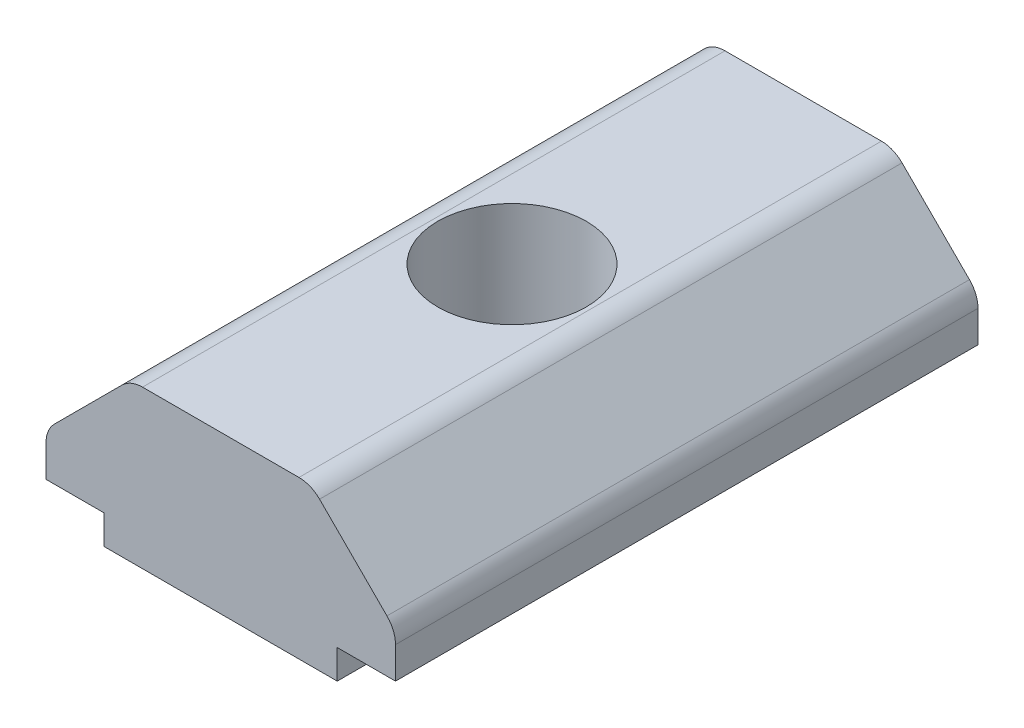
ISO-10303-21;
HEADER;
FILE_DESCRIPTION(('STEP AP214'),'2;1');
FILE_NAME('part.step','',(''),(''),'','','');
FILE_SCHEMA(('AUTOMOTIVE_DESIGN { 1 0 10303 214 1 1 1 1 }'));
ENDSEC;
DATA;
#1=APPLICATION_CONTEXT('core data for automotive mechanical design processes');
#2=APPLICATION_PROTOCOL_DEFINITION('international standard','automotive_design',2000,#1);
#3=PRODUCT_CONTEXT('',#1,'mechanical');
#4=PRODUCT('Part','Part','',(#3));
#5=PRODUCT_RELATED_PRODUCT_CATEGORY('part','',(#4));
#6=PRODUCT_DEFINITION_FORMATION('','',#4);
#7=PRODUCT_DEFINITION_CONTEXT('part definition',#1,'design');
#8=PRODUCT_DEFINITION('design','',#6,#7);
#9=PRODUCT_DEFINITION_SHAPE('','',#8);
#10=(LENGTH_UNIT() NAMED_UNIT(*) SI_UNIT(.MILLI.,.METRE.));
#11=(NAMED_UNIT(*) PLANE_ANGLE_UNIT() SI_UNIT($,.RADIAN.));
#12=(NAMED_UNIT(*) SI_UNIT($,.STERADIAN.) SOLID_ANGLE_UNIT());
#13=UNCERTAINTY_MEASURE_WITH_UNIT(LENGTH_MEASURE(1.E-05),#10,'distance_accuracy_value','');
#14=(GEOMETRIC_REPRESENTATION_CONTEXT(3) GLOBAL_UNCERTAINTY_ASSIGNED_CONTEXT((#13)) GLOBAL_UNIT_ASSIGNED_CONTEXT((#10,
#11,#12)) REPRESENTATION_CONTEXT('',''));
#15=CARTESIAN_POINT('',(0.,0.,0.));
#16=DIRECTION('',(0.,0.,1.));
#17=DIRECTION('',(1.,0.,0.));
#18=AXIS2_PLACEMENT_3D('',#15,#16,#17);
#19=CARTESIAN_POINT('',(0.,1.,20.));
#20=DIRECTION('',(1.,0.,0.));
#21=DIRECTION('',(0.,0.,-1.));
#22=AXIS2_PLACEMENT_3D('',#19,#20,#21);
#23=PLANE('',#22);
#24=DIRECTION('',(0.,-1.,0.));
#25=VECTOR('',#24,1.);
#26=CARTESIAN_POINT('',(0.,1.,0.));
#27=LINE('',#26,#25);
#28=CARTESIAN_POINT('',(0.,1.,0.));
#29=VERTEX_POINT('',#28);
#30=CARTESIAN_POINT('',(0.,0.,0.));
#31=VERTEX_POINT('',#30);
#32=EDGE_CURVE('E156',#29,#31,#27,.T.);
#33=ORIENTED_EDGE('',*,*,#32,.T.);
#34=DIRECTION('',(0.,0.,-1.));
#35=VECTOR('',#34,1.);
#36=CARTESIAN_POINT('',(0.,0.,20.));
#37=LINE('',#36,#35);
#38=CARTESIAN_POINT('',(0.,0.,20.));
#39=VERTEX_POINT('',#38);
#40=EDGE_CURVE('E137',#39,#31,#37,.T.);
#41=ORIENTED_EDGE('',*,*,#40,.F.);
#42=DIRECTION('',(0.,-1.,0.));
#43=VECTOR('',#42,1.);
#44=CARTESIAN_POINT('',(0.,1.,20.));
#45=LINE('',#44,#43);
#46=CARTESIAN_POINT('',(0.,1.,20.));
#47=VERTEX_POINT('',#46);
#48=EDGE_CURVE('E143',#47,#39,#45,.T.);
#49=ORIENTED_EDGE('',*,*,#48,.F.);
#50=DIRECTION('',(0.,0.,-1.));
#51=VECTOR('',#50,1.);
#52=CARTESIAN_POINT('',(0.,1.,20.));
#53=LINE('',#52,#51);
#54=EDGE_CURVE('E216',#47,#29,#53,.T.);
#55=ORIENTED_EDGE('',*,*,#54,.T.);
#56=EDGE_LOOP('',(#33,#41,#49,#55));
#57=FACE_BOUND('',#56,.T.);
#58=ADVANCED_FACE('F32',(#57),#23,.F.);
#59=CARTESIAN_POINT('',(0.,0.,20.));
#60=DIRECTION('',(0.,1.,0.));
#61=DIRECTION('',(0.,0.,1.));
#62=AXIS2_PLACEMENT_3D('',#59,#60,#61);
#63=PLANE('',#62);
#64=CARTESIAN_POINT('',(4.,0.,10.));
#65=DIRECTION('',(0.,1.,0.));
#66=DIRECTION('',(0.,0.,1.));
#67=AXIS2_PLACEMENT_3D('',#64,#65,#66);
#68=CIRCLE('',#67,2.55);
#69=CARTESIAN_POINT('',(4.,0.,12.55));
#70=VERTEX_POINT('',#69);
#71=EDGE_CURVE('E243',#70,#70,#68,.T.);
#72=ORIENTED_EDGE('',*,*,#71,.T.);
#73=EDGE_LOOP('',(#72));
#74=FACE_BOUND('',#73,.T.);
#75=DIRECTION('',(1.,0.,0.));
#76=VECTOR('',#75,1.);
#77=CARTESIAN_POINT('',(0.,0.,0.));
#78=LINE('',#77,#76);
#79=CARTESIAN_POINT('',(8.,0.,0.));
#80=VERTEX_POINT('',#79);
#81=EDGE_CURVE('E238',#31,#80,#78,.T.);
#82=ORIENTED_EDGE('',*,*,#81,.T.);
#83=DIRECTION('',(0.,0.,-1.));
#84=VECTOR('',#83,1.);
#85=CARTESIAN_POINT('',(8.,0.,20.));
#86=LINE('',#85,#84);
#87=CARTESIAN_POINT('',(8.,0.,20.));
#88=VERTEX_POINT('',#87);
#89=EDGE_CURVE('E140',#88,#80,#86,.T.);
#90=ORIENTED_EDGE('',*,*,#89,.F.);
#91=DIRECTION('',(1.,0.,0.));
#92=VECTOR('',#91,1.);
#93=CARTESIAN_POINT('',(0.,0.,20.));
#94=LINE('',#93,#92);
#95=EDGE_CURVE('E133',#39,#88,#94,.T.);
#96=ORIENTED_EDGE('',*,*,#95,.F.);
#97=ORIENTED_EDGE('',*,*,#40,.T.);
#98=EDGE_LOOP('',(#82,#90,#96,#97));
#99=FACE_BOUND('',#98,.T.);
#100=ADVANCED_FACE('F135',(#74,#99),#63,.F.);
#101=CARTESIAN_POINT('',(8.,0.,20.));
#102=DIRECTION('',(-1.,0.,0.));
#103=DIRECTION('',(0.,0.,1.));
#104=AXIS2_PLACEMENT_3D('',#101,#102,#103);
#105=PLANE('',#104);
#106=DIRECTION('',(0.,1.,0.));
#107=VECTOR('',#106,1.);
#108=CARTESIAN_POINT('',(8.,0.,0.));
#109=LINE('',#108,#107);
#110=CARTESIAN_POINT('',(8.,1.,0.));
#111=VERTEX_POINT('',#110);
#112=EDGE_CURVE('E235',#80,#111,#109,.T.);
#113=ORIENTED_EDGE('',*,*,#112,.T.);
#114=DIRECTION('',(0.,0.,-1.));
#115=VECTOR('',#114,1.);
#116=CARTESIAN_POINT('',(8.,1.,20.));
#117=LINE('',#116,#115);
#118=CARTESIAN_POINT('',(8.,1.,20.));
#119=VERTEX_POINT('',#118);
#120=EDGE_CURVE('E162',#119,#111,#117,.T.);
#121=ORIENTED_EDGE('',*,*,#120,.F.);
#122=DIRECTION('',(0.,1.,0.));
#123=VECTOR('',#122,1.);
#124=CARTESIAN_POINT('',(8.,0.,20.));
#125=LINE('',#124,#123);
#126=EDGE_CURVE('E142',#88,#119,#125,.T.);
#127=ORIENTED_EDGE('',*,*,#126,.F.);
#128=ORIENTED_EDGE('',*,*,#89,.T.);
#129=EDGE_LOOP('',(#113,#121,#127,#128));
#130=FACE_BOUND('',#129,.T.);
#131=ADVANCED_FACE('F289',(#130),#105,.F.);
#132=CARTESIAN_POINT('',(8.,1.,20.));
#133=DIRECTION('',(0.,1.,0.));
#134=DIRECTION('',(0.,0.,1.));
#135=AXIS2_PLACEMENT_3D('',#132,#133,#134);
#136=PLANE('',#135);
#137=DIRECTION('',(1.,0.,0.));
#138=VECTOR('',#137,1.);
#139=CARTESIAN_POINT('',(8.,1.,0.));
#140=LINE('',#139,#138);
#141=CARTESIAN_POINT('',(10.,1.,0.));
#142=VERTEX_POINT('',#141);
#143=EDGE_CURVE('E230',#111,#142,#140,.T.);
#144=ORIENTED_EDGE('',*,*,#143,.T.);
#145=DIRECTION('',(0.,0.,-1.));
#146=VECTOR('',#145,1.);
#147=CARTESIAN_POINT('',(10.,1.,20.));
#148=LINE('',#147,#146);
#149=CARTESIAN_POINT('',(10.,1.,20.));
#150=VERTEX_POINT('',#149);
#151=EDGE_CURVE('E221',#150,#142,#148,.T.);
#152=ORIENTED_EDGE('',*,*,#151,.F.);
#153=DIRECTION('',(1.,0.,0.));
#154=VECTOR('',#153,1.);
#155=CARTESIAN_POINT('',(8.,1.,20.));
#156=LINE('',#155,#154);
#157=EDGE_CURVE('E231',#119,#150,#156,.T.);
#158=ORIENTED_EDGE('',*,*,#157,.F.);
#159=ORIENTED_EDGE('',*,*,#120,.T.);
#160=EDGE_LOOP('',(#144,#152,#158,#159));
#161=FACE_BOUND('',#160,.T.);
#162=ADVANCED_FACE('F228',(#161),#136,.F.);
#163=CARTESIAN_POINT('',(10.,1.,20.));
#164=DIRECTION('',(-1.,0.,0.));
#165=DIRECTION('',(0.,0.,1.));
#166=AXIS2_PLACEMENT_3D('',#163,#164,#165);
#167=PLANE('',#166);
#168=DIRECTION('',(0.,1.,0.));
#169=VECTOR('',#168,1.);
#170=CARTESIAN_POINT('',(10.,1.,0.));
#171=LINE('',#170,#169);
#172=CARTESIAN_POINT('',(10.,2.0857864376269,0.));
#173=VERTEX_POINT('',#172);
#174=EDGE_CURVE('E210',#142,#173,#171,.T.);
#175=ORIENTED_EDGE('',*,*,#174,.T.);
#176=DIRECTION('',(0.,0.,-1.));
#177=VECTOR('',#176,1.);
#178=CARTESIAN_POINT('',(10.,2.0857864376269,20.));
#179=LINE('',#178,#177);
#180=CARTESIAN_POINT('',(10.,2.0857864376269,20.));
#181=VERTEX_POINT('',#180);
#182=EDGE_CURVE('E190',#173,#181,#179,.F.);
#183=ORIENTED_EDGE('',*,*,#182,.T.);
#184=DIRECTION('',(0.,1.,0.));
#185=VECTOR('',#184,1.);
#186=CARTESIAN_POINT('',(10.,1.,20.));
#187=LINE('',#186,#185);
#188=EDGE_CURVE('E252',#150,#181,#187,.T.);
#189=ORIENTED_EDGE('',*,*,#188,.F.);
#190=ORIENTED_EDGE('',*,*,#151,.T.);
#191=EDGE_LOOP('',(#175,#183,#189,#190));
#192=FACE_BOUND('',#191,.T.);
#193=ADVANCED_FACE('F281',(#192),#167,.F.);
#194=CARTESIAN_POINT('',(10.,2.5,20.));
#195=DIRECTION('',(-0.707106781186548,-0.707106781186548,0.));
#196=DIRECTION('',(0.707106781186548,-0.707106781186548,0.));
#197=AXIS2_PLACEMENT_3D('',#194,#195,#196);
#198=PLANE('',#197);
#199=DIRECTION('',(-0.707106781186548,0.707106781186548,0.));
#200=VECTOR('',#199,1.);
#201=CARTESIAN_POINT('',(10.,2.5,20.));
#202=LINE('',#201,#200);
#203=CARTESIAN_POINT('',(9.70710678118655,2.79289321881345,20.));
#204=VERTEX_POINT('',#203);
#205=CARTESIAN_POINT('',(7.39289321881345,5.10710678118655,20.));
#206=VERTEX_POINT('',#205);
#207=EDGE_CURVE('E250',#204,#206,#202,.T.);
#208=ORIENTED_EDGE('',*,*,#207,.F.);
#209=DIRECTION('',(0.,0.,-1.));
#210=VECTOR('',#209,1.);
#211=CARTESIAN_POINT('',(9.70710678118655,2.79289321881345,20.));
#212=LINE('',#211,#210);
#213=CARTESIAN_POINT('',(9.70710678118655,2.79289321881345,0.));
#214=VERTEX_POINT('',#213);
#215=EDGE_CURVE('E187',#204,#214,#212,.T.);
#216=ORIENTED_EDGE('',*,*,#215,.T.);
#217=DIRECTION('',(-0.707106781186548,0.707106781186548,0.));
#218=VECTOR('',#217,1.);
#219=CARTESIAN_POINT('',(10.,2.5,0.));
#220=LINE('',#219,#218);
#221=CARTESIAN_POINT('',(7.39289321881345,5.10710678118655,0.));
#222=VERTEX_POINT('',#221);
#223=EDGE_CURVE('E205',#214,#222,#220,.T.);
#224=ORIENTED_EDGE('',*,*,#223,.T.);
#225=DIRECTION('',(0.,0.,-1.));
#226=VECTOR('',#225,1.);
#227=CARTESIAN_POINT('',(7.39289321881345,5.10710678118655,20.));
#228=LINE('',#227,#226);
#229=EDGE_CURVE('E185',#222,#206,#228,.F.);
#230=ORIENTED_EDGE('',*,*,#229,.T.);
#231=EDGE_LOOP('',(#208,#216,#224,#230));
#232=FACE_BOUND('',#231,.T.);
#233=ADVANCED_FACE('F272',(#232),#198,.F.);
#234=CARTESIAN_POINT('',(7.1,5.4,20.));
#235=DIRECTION('',(0.,-1.,0.));
#236=DIRECTION('',(0.,0.,-1.));
#237=AXIS2_PLACEMENT_3D('',#234,#235,#236);
#238=PLANE('',#237);
#239=CARTESIAN_POINT('',(4.,5.4,10.));
#240=DIRECTION('',(0.,1.,0.));
#241=DIRECTION('',(0.,0.,1.));
#242=AXIS2_PLACEMENT_3D('',#239,#240,#241);
#243=CIRCLE('',#242,2.55);
#244=CARTESIAN_POINT('',(4.,5.4,12.55));
#245=VERTEX_POINT('',#244);
#246=EDGE_CURVE('E257',#245,#245,#243,.T.);
#247=ORIENTED_EDGE('',*,*,#246,.F.);
#248=EDGE_LOOP('',(#247));
#249=FACE_BOUND('',#248,.T.);
#250=DIRECTION('',(-1.,0.,0.));
#251=VECTOR('',#250,1.);
#252=CARTESIAN_POINT('',(7.1,5.4,0.));
#253=LINE('',#252,#251);
#254=CARTESIAN_POINT('',(6.68578643762691,5.4,0.));
#255=VERTEX_POINT('',#254);
#256=CARTESIAN_POINT('',(1.3142135623731,5.4,0.));
#257=VERTEX_POINT('',#256);
#258=EDGE_CURVE('E195',#255,#257,#253,.T.);
#259=ORIENTED_EDGE('',*,*,#258,.T.);
#260=DIRECTION('',(0.,0.,-1.));
#261=VECTOR('',#260,1.);
#262=CARTESIAN_POINT('',(1.3142135623731,5.4,20.));
#263=LINE('',#262,#261);
#264=CARTESIAN_POINT('',(1.3142135623731,5.4,20.));
#265=VERTEX_POINT('',#264);
#266=EDGE_CURVE('E11',#257,#265,#263,.F.);
#267=ORIENTED_EDGE('',*,*,#266,.T.);
#268=DIRECTION('',(-1.,0.,0.));
#269=VECTOR('',#268,1.);
#270=CARTESIAN_POINT('',(7.1,5.4,20.));
#271=LINE('',#270,#269);
#272=CARTESIAN_POINT('',(6.68578643762691,5.4,20.));
#273=VERTEX_POINT('',#272);
#274=EDGE_CURVE('E196',#273,#265,#271,.T.);
#275=ORIENTED_EDGE('',*,*,#274,.F.);
#276=DIRECTION('',(0.,0.,-1.));
#277=VECTOR('',#276,1.);
#278=CARTESIAN_POINT('',(6.68578643762691,5.4,20.));
#279=LINE('',#278,#277);
#280=EDGE_CURVE('E40',#273,#255,#279,.T.);
#281=ORIENTED_EDGE('',*,*,#280,.T.);
#282=EDGE_LOOP('',(#259,#267,#275,#281));
#283=FACE_BOUND('',#282,.T.);
#284=ADVANCED_FACE('F194',(#249,#283),#238,.F.);
#285=CARTESIAN_POINT('',(0.9,5.4,20.));
#286=DIRECTION('',(0.707106781186548,-0.707106781186548,0.));
#287=DIRECTION('',(0.707106781186548,0.707106781186548,0.));
#288=AXIS2_PLACEMENT_3D('',#285,#286,#287);
#289=PLANE('',#288);
#290=DIRECTION('',(-0.707106781186548,-0.707106781186548,0.));
#291=VECTOR('',#290,1.);
#292=CARTESIAN_POINT('',(0.9,5.4,0.));
#293=LINE('',#292,#291);
#294=CARTESIAN_POINT('',(0.607106781186548,5.10710678118655,0.));
#295=VERTEX_POINT('',#294);
#296=CARTESIAN_POINT('',(-1.70710678118655,2.79289321881345,0.));
#297=VERTEX_POINT('',#296);
#298=EDGE_CURVE('E204',#295,#297,#293,.T.);
#299=ORIENTED_EDGE('',*,*,#298,.T.);
#300=DIRECTION('',(0.,0.,-1.));
#301=VECTOR('',#300,1.);
#302=CARTESIAN_POINT('',(-1.70710678118655,2.79289321881345,20.));
#303=LINE('',#302,#301);
#304=CARTESIAN_POINT('',(-1.70710678118655,2.79289321881345,20.));
#305=VERTEX_POINT('',#304);
#306=EDGE_CURVE('E176',#297,#305,#303,.F.);
#307=ORIENTED_EDGE('',*,*,#306,.T.);
#308=DIRECTION('',(-0.707106781186548,-0.707106781186548,0.));
#309=VECTOR('',#308,1.);
#310=CARTESIAN_POINT('',(0.9,5.4,20.));
#311=LINE('',#310,#309);
#312=CARTESIAN_POINT('',(0.607106781186548,5.10710678118655,20.));
#313=VERTEX_POINT('',#312);
#314=EDGE_CURVE('E247',#313,#305,#311,.T.);
#315=ORIENTED_EDGE('',*,*,#314,.F.);
#316=DIRECTION('',(0.,0.,-1.));
#317=VECTOR('',#316,1.);
#318=CARTESIAN_POINT('',(0.607106781186548,5.10710678118655,20.));
#319=LINE('',#318,#317);
#320=EDGE_CURVE('E173',#313,#295,#319,.T.);
#321=ORIENTED_EDGE('',*,*,#320,.T.);
#322=EDGE_LOOP('',(#299,#307,#315,#321));
#323=FACE_BOUND('',#322,.T.);
#324=ADVANCED_FACE('F271',(#323),#289,.F.);
#325=CARTESIAN_POINT('',(-2.,2.5,20.));
#326=DIRECTION('',(1.,0.,0.));
#327=DIRECTION('',(0.,1.,0.));
#328=AXIS2_PLACEMENT_3D('',#325,#326,#327);
#329=PLANE('',#328);
#330=DIRECTION('',(0.,-1.,0.));
#331=VECTOR('',#330,1.);
#332=CARTESIAN_POINT('',(-2.,2.5,20.));
#333=LINE('',#332,#331);
#334=CARTESIAN_POINT('',(-2.,2.08578643762691,20.));
#335=VERTEX_POINT('',#334);
#336=CARTESIAN_POINT('',(-2.,1.,20.));
#337=VERTEX_POINT('',#336);
#338=EDGE_CURVE('E245',#335,#337,#333,.T.);
#339=ORIENTED_EDGE('',*,*,#338,.F.);
#340=DIRECTION('',(0.,0.,-1.));
#341=VECTOR('',#340,1.);
#342=CARTESIAN_POINT('',(-2.,2.08578643762691,20.));
#343=LINE('',#342,#341);
#344=CARTESIAN_POINT('',(-2.,2.08578643762691,0.));
#345=VERTEX_POINT('',#344);
#346=EDGE_CURVE('E157',#335,#345,#343,.T.);
#347=ORIENTED_EDGE('',*,*,#346,.T.);
#348=DIRECTION('',(0.,-1.,0.));
#349=VECTOR('',#348,1.);
#350=CARTESIAN_POINT('',(-2.,2.5,0.));
#351=LINE('',#350,#349);
#352=CARTESIAN_POINT('',(-2.,1.,0.));
#353=VERTEX_POINT('',#352);
#354=EDGE_CURVE('E208',#345,#353,#351,.T.);
#355=ORIENTED_EDGE('',*,*,#354,.T.);
#356=DIRECTION('',(0.,0.,-1.));
#357=VECTOR('',#356,1.);
#358=CARTESIAN_POINT('',(-2.,1.,20.));
#359=LINE('',#358,#357);
#360=EDGE_CURVE('E218',#337,#353,#359,.T.);
#361=ORIENTED_EDGE('',*,*,#360,.F.);
#362=EDGE_LOOP('',(#339,#347,#355,#361));
#363=FACE_BOUND('',#362,.T.);
#364=ADVANCED_FACE('F278',(#363),#329,.F.);
#365=CARTESIAN_POINT('',(-2.,1.,20.));
#366=DIRECTION('',(0.,1.,0.));
#367=DIRECTION('',(0.,0.,1.));
#368=AXIS2_PLACEMENT_3D('',#365,#366,#367);
#369=PLANE('',#368);
#370=DIRECTION('',(1.,0.,0.));
#371=VECTOR('',#370,1.);
#372=CARTESIAN_POINT('',(-2.,1.,0.));
#373=LINE('',#372,#371);
#374=EDGE_CURVE('E153',#353,#29,#373,.T.);
#375=ORIENTED_EDGE('',*,*,#374,.T.);
#376=ORIENTED_EDGE('',*,*,#54,.F.);
#377=DIRECTION('',(1.,0.,0.));
#378=VECTOR('',#377,1.);
#379=CARTESIAN_POINT('',(-2.,1.,20.));
#380=LINE('',#379,#378);
#381=EDGE_CURVE('E149',#337,#47,#380,.T.);
#382=ORIENTED_EDGE('',*,*,#381,.F.);
#383=ORIENTED_EDGE('',*,*,#360,.T.);
#384=EDGE_LOOP('',(#375,#376,#382,#383));
#385=FACE_BOUND('',#384,.T.);
#386=ADVANCED_FACE('F317',(#385),#369,.F.);
#387=CARTESIAN_POINT('',(0.,0.,20.));
#388=DIRECTION('',(0.,0.,1.));
#389=DIRECTION('',(1.,0.,0.));
#390=AXIS2_PLACEMENT_3D('',#387,#388,#389);
#391=PLANE('',#390);
#392=ORIENTED_EDGE('',*,*,#314,.T.);
#393=CARTESIAN_POINT('',(-1.,2.08578643762691,20.));
#394=DIRECTION('',(0.,0.,1.));
#395=DIRECTION('',(1.,0.,0.));
#396=AXIS2_PLACEMENT_3D('',#393,#394,#395);
#397=CIRCLE('',#396,1.);
#398=EDGE_CURVE('E183',#305,#335,#397,.T.);
#399=ORIENTED_EDGE('',*,*,#398,.T.);
#400=ORIENTED_EDGE('',*,*,#338,.T.);
#401=ORIENTED_EDGE('',*,*,#381,.T.);
#402=ORIENTED_EDGE('',*,*,#48,.T.);
#403=ORIENTED_EDGE('',*,*,#95,.T.);
#404=ORIENTED_EDGE('',*,*,#126,.T.);
#405=ORIENTED_EDGE('',*,*,#157,.T.);
#406=ORIENTED_EDGE('',*,*,#188,.T.);
#407=CARTESIAN_POINT('',(9.,2.0857864376269,20.));
#408=DIRECTION('',(0.,0.,1.));
#409=DIRECTION('',(1.,0.,0.));
#410=AXIS2_PLACEMENT_3D('',#407,#408,#409);
#411=CIRCLE('',#410,1.);
#412=EDGE_CURVE('E181',#181,#204,#411,.T.);
#413=ORIENTED_EDGE('',*,*,#412,.T.);
#414=ORIENTED_EDGE('',*,*,#207,.T.);
#415=CARTESIAN_POINT('',(6.68578643762691,4.4,20.));
#416=DIRECTION('',(0.,0.,1.));
#417=DIRECTION('',(1.,0.,0.));
#418=AXIS2_PLACEMENT_3D('',#415,#416,#417);
#419=CIRCLE('',#418,1.);
#420=EDGE_CURVE('E52',#206,#273,#419,.T.);
#421=ORIENTED_EDGE('',*,*,#420,.T.);
#422=ORIENTED_EDGE('',*,*,#274,.T.);
#423=CARTESIAN_POINT('',(1.3142135623731,4.4,20.));
#424=DIRECTION('',(0.,0.,1.));
#425=DIRECTION('',(1.,0.,0.));
#426=AXIS2_PLACEMENT_3D('',#423,#424,#425);
#427=CIRCLE('',#426,1.);
#428=EDGE_CURVE('E179',#265,#313,#427,.T.);
#429=ORIENTED_EDGE('',*,*,#428,.T.);
#430=EDGE_LOOP('',(#392,#399,#400,#401,#402,#403,#404,#405,#406,#413,#414,#421,#422,#429));
#431=FACE_BOUND('',#430,.T.);
#432=ADVANCED_FACE('F147',(#431),#391,.T.);
#433=CARTESIAN_POINT('',(0.,0.,0.));
#434=DIRECTION('',(0.,0.,1.));
#435=DIRECTION('',(1.,0.,0.));
#436=AXIS2_PLACEMENT_3D('',#433,#434,#435);
#437=PLANE('',#436);
#438=ORIENTED_EDGE('',*,*,#354,.F.);
#439=CARTESIAN_POINT('',(-1.,2.08578643762691,0.));
#440=DIRECTION('',(0.,0.,1.));
#441=DIRECTION('',(1.,0.,0.));
#442=AXIS2_PLACEMENT_3D('',#439,#440,#441);
#443=CIRCLE('',#442,1.);
#444=EDGE_CURVE('E171',#345,#297,#443,.F.);
#445=ORIENTED_EDGE('',*,*,#444,.T.);
#446=ORIENTED_EDGE('',*,*,#298,.F.);
#447=CARTESIAN_POINT('',(1.3142135623731,4.4,0.));
#448=DIRECTION('',(0.,0.,1.));
#449=DIRECTION('',(1.,0.,0.));
#450=AXIS2_PLACEMENT_3D('',#447,#448,#449);
#451=CIRCLE('',#450,1.);
#452=EDGE_CURVE('E167',#295,#257,#451,.F.);
#453=ORIENTED_EDGE('',*,*,#452,.T.);
#454=ORIENTED_EDGE('',*,*,#258,.F.);
#455=CARTESIAN_POINT('',(6.68578643762691,4.4,0.));
#456=DIRECTION('',(0.,0.,1.));
#457=DIRECTION('',(1.,0.,0.));
#458=AXIS2_PLACEMENT_3D('',#455,#456,#457);
#459=CIRCLE('',#458,1.);
#460=EDGE_CURVE('E160',#255,#222,#459,.F.);
#461=ORIENTED_EDGE('',*,*,#460,.T.);
#462=ORIENTED_EDGE('',*,*,#223,.F.);
#463=CARTESIAN_POINT('',(9.,2.0857864376269,0.));
#464=DIRECTION('',(0.,0.,1.));
#465=DIRECTION('',(1.,0.,0.));
#466=AXIS2_PLACEMENT_3D('',#463,#464,#465);
#467=CIRCLE('',#466,1.);
#468=EDGE_CURVE('E169',#214,#173,#467,.F.);
#469=ORIENTED_EDGE('',*,*,#468,.T.);
#470=ORIENTED_EDGE('',*,*,#174,.F.);
#471=ORIENTED_EDGE('',*,*,#143,.F.);
#472=ORIENTED_EDGE('',*,*,#112,.F.);
#473=ORIENTED_EDGE('',*,*,#81,.F.);
#474=ORIENTED_EDGE('',*,*,#32,.F.);
#475=ORIENTED_EDGE('',*,*,#374,.F.);
#476=EDGE_LOOP('',(#438,#445,#446,#453,#454,#461,#462,#469,#470,#471,#472,#473,#474,#475));
#477=FACE_BOUND('',#476,.T.);
#478=ADVANCED_FACE('F200',(#477),#437,.F.);
#479=CARTESIAN_POINT('',(-1.,2.08578643762691,20.));
#480=DIRECTION('',(0.,0.,-1.));
#481=DIRECTION('',(-1.,0.,0.));
#482=AXIS2_PLACEMENT_3D('',#479,#480,#481);
#483=CYLINDRICAL_SURFACE('',#482,1.);
#484=ORIENTED_EDGE('',*,*,#398,.F.);
#485=ORIENTED_EDGE('',*,*,#306,.F.);
#486=ORIENTED_EDGE('',*,*,#444,.F.);
#487=ORIENTED_EDGE('',*,*,#346,.F.);
#488=EDGE_LOOP('',(#484,#485,#486,#487));
#489=FACE_BOUND('',#488,.T.);
#490=ADVANCED_FACE('F293',(#489),#483,.T.);
#491=CARTESIAN_POINT('',(9.,2.0857864376269,20.));
#492=DIRECTION('',(0.,0.,-1.));
#493=DIRECTION('',(-1.,0.,0.));
#494=AXIS2_PLACEMENT_3D('',#491,#492,#493);
#495=CYLINDRICAL_SURFACE('',#494,1.);
#496=ORIENTED_EDGE('',*,*,#412,.F.);
#497=ORIENTED_EDGE('',*,*,#182,.F.);
#498=ORIENTED_EDGE('',*,*,#468,.F.);
#499=ORIENTED_EDGE('',*,*,#215,.F.);
#500=EDGE_LOOP('',(#496,#497,#498,#499));
#501=FACE_BOUND('',#500,.T.);
#502=ADVANCED_FACE('F296',(#501),#495,.T.);
#503=CARTESIAN_POINT('',(1.3142135623731,4.4,20.));
#504=DIRECTION('',(0.,0.,-1.));
#505=DIRECTION('',(-1.,0.,0.));
#506=AXIS2_PLACEMENT_3D('',#503,#504,#505);
#507=CYLINDRICAL_SURFACE('',#506,1.);
#508=ORIENTED_EDGE('',*,*,#428,.F.);
#509=ORIENTED_EDGE('',*,*,#266,.F.);
#510=ORIENTED_EDGE('',*,*,#452,.F.);
#511=ORIENTED_EDGE('',*,*,#320,.F.);
#512=EDGE_LOOP('',(#508,#509,#510,#511));
#513=FACE_BOUND('',#512,.T.);
#514=ADVANCED_FACE('F299',(#513),#507,.T.);
#515=CARTESIAN_POINT('',(6.68578643762691,4.4,20.));
#516=DIRECTION('',(0.,0.,-1.));
#517=DIRECTION('',(-1.,0.,0.));
#518=AXIS2_PLACEMENT_3D('',#515,#516,#517);
#519=CYLINDRICAL_SURFACE('',#518,1.);
#520=ORIENTED_EDGE('',*,*,#420,.F.);
#521=ORIENTED_EDGE('',*,*,#229,.F.);
#522=ORIENTED_EDGE('',*,*,#460,.F.);
#523=ORIENTED_EDGE('',*,*,#280,.F.);
#524=EDGE_LOOP('',(#520,#521,#522,#523));
#525=FACE_BOUND('',#524,.T.);
#526=ADVANCED_FACE('F34',(#525),#519,.T.);
#527=CARTESIAN_POINT('',(4.,0.,10.));
#528=DIRECTION('',(0.,1.,0.));
#529=DIRECTION('',(0.,0.,1.));
#530=AXIS2_PLACEMENT_3D('',#527,#528,#529);
#531=CYLINDRICAL_SURFACE('',#530,2.55);
#532=CARTESIAN_POINT('',(4.,0.,12.55));
#533=CARTESIAN_POINT('',(4.,0.05625,12.55));
#534=CARTESIAN_POINT('',(4.,0.1125,12.55));
#535=CARTESIAN_POINT('',(4.,0.225,12.55));
#536=CARTESIAN_POINT('',(4.,0.28125,12.55));
#537=CARTESIAN_POINT('',(4.,0.39375,12.55));
#538=CARTESIAN_POINT('',(4.,0.45,12.55));
#539=CARTESIAN_POINT('',(4.,0.5625,12.55));
#540=CARTESIAN_POINT('',(4.,0.61875,12.55));
#541=CARTESIAN_POINT('',(4.,0.73125,12.55));
#542=CARTESIAN_POINT('',(4.,0.7875,12.55));
#543=CARTESIAN_POINT('',(4.,0.9,12.55));
#544=CARTESIAN_POINT('',(4.,0.95625,12.55));
#545=CARTESIAN_POINT('',(4.,1.06875,12.55));
#546=CARTESIAN_POINT('',(4.,1.125,12.55));
#547=CARTESIAN_POINT('',(4.,1.2375,12.55));
#548=CARTESIAN_POINT('',(4.,1.29375,12.55));
#549=CARTESIAN_POINT('',(4.,1.40625,12.55));
#550=CARTESIAN_POINT('',(4.,1.4625,12.55));
#551=CARTESIAN_POINT('',(4.,1.575,12.55));
#552=CARTESIAN_POINT('',(4.,1.63125,12.55));
#553=CARTESIAN_POINT('',(4.,1.74375,12.55));
#554=CARTESIAN_POINT('',(4.,1.8,12.55));
#555=CARTESIAN_POINT('',(4.,1.9125,12.55));
#556=CARTESIAN_POINT('',(4.,1.96875,12.55));
#557=CARTESIAN_POINT('',(4.,2.08125,12.55));
#558=CARTESIAN_POINT('',(4.,2.1375,12.55));
#559=CARTESIAN_POINT('',(4.,2.25,12.55));
#560=CARTESIAN_POINT('',(4.,2.30625,12.55));
#561=CARTESIAN_POINT('',(4.,2.41875,12.55));
#562=CARTESIAN_POINT('',(4.,2.475,12.55));
#563=CARTESIAN_POINT('',(4.,2.5875,12.55));
#564=CARTESIAN_POINT('',(4.,2.64375,12.55));
#565=CARTESIAN_POINT('',(4.,2.75625,12.55));
#566=CARTESIAN_POINT('',(4.,2.8125,12.55));
#567=CARTESIAN_POINT('',(4.,2.925,12.55));
#568=CARTESIAN_POINT('',(4.,2.98125,12.55));
#569=CARTESIAN_POINT('',(4.,3.09375,12.55));
#570=CARTESIAN_POINT('',(4.,3.15,12.55));
#571=CARTESIAN_POINT('',(4.,3.2625,12.55));
#572=CARTESIAN_POINT('',(4.,3.31875,12.55));
#573=CARTESIAN_POINT('',(4.,3.43125,12.55));
#574=CARTESIAN_POINT('',(4.,3.4875,12.55));
#575=CARTESIAN_POINT('',(4.,3.6,12.55));
#576=CARTESIAN_POINT('',(4.,3.65625,12.55));
#577=CARTESIAN_POINT('',(4.,3.76875,12.55));
#578=CARTESIAN_POINT('',(4.,3.825,12.55));
#579=CARTESIAN_POINT('',(4.,3.9375,12.55));
#580=CARTESIAN_POINT('',(4.,3.99375,12.55));
#581=CARTESIAN_POINT('',(4.,4.10625,12.55));
#582=CARTESIAN_POINT('',(4.,4.1625,12.55));
#583=CARTESIAN_POINT('',(4.,4.275,12.55));
#584=CARTESIAN_POINT('',(4.,4.33125,12.55));
#585=CARTESIAN_POINT('',(4.,4.44375,12.55));
#586=CARTESIAN_POINT('',(4.,4.5,12.55));
#587=CARTESIAN_POINT('',(4.,4.6125,12.55));
#588=CARTESIAN_POINT('',(4.,4.66875,12.55));
#589=CARTESIAN_POINT('',(4.,4.78125,12.55));
#590=CARTESIAN_POINT('',(4.,4.8375,12.55));
#591=CARTESIAN_POINT('',(4.,4.95,12.55));
#592=CARTESIAN_POINT('',(4.,5.00625,12.55));
#593=CARTESIAN_POINT('',(4.,5.11875,12.55));
#594=CARTESIAN_POINT('',(4.,5.175,12.55));
#595=CARTESIAN_POINT('',(4.,5.2875,12.55));
#596=CARTESIAN_POINT('',(4.,5.34375,12.55));
#597=CARTESIAN_POINT('',(4.,5.4,12.55));
#598=B_SPLINE_CURVE_WITH_KNOTS('',3,(#532,#533,#534,#535,#536,#537,#538,#539,#540,#541,#542,
#543,#544,#545,#546,#547,#548,#549,#550,#551,#552,#553,#554,#555,#556,#557,#558,#559,#560,#561,
#562,#563,#564,#565,#566,#567,#568,#569,#570,#571,#572,#573,#574,#575,#576,#577,#578,#579,#580,
#581,#582,#583,#584,#585,#586,#587,#588,#589,#590,#591,#592,#593,#594,#595,#596,#597),
.UNSPECIFIED.,.F.,.F.,(4,2,2,2,2,2,2,2,2,2,2,2,2,2,2,2,2,2,2,2,2,2,2,2,2,2,2,2,2,2,2,2,4),(0.,
0.16875,0.3375,0.50625,0.675,0.84375,1.0125,1.18125,1.35,1.51875,1.6875,1.85625,2.025,2.19375,
2.3625,2.53125,2.7,2.86875,3.0375,3.20625,3.375,3.54375,3.7125,3.88125,4.05,4.21875,4.3875,
4.55625,4.725,4.89375,5.0625,5.23125,5.4),.UNSPECIFIED.);
#599=EDGE_CURVE('BSEAM264',#70,#245,#598,.T.);
#600=ORIENTED_EDGE('',*,*,#71,.F.);
#601=ORIENTED_EDGE('',*,*,#246,.T.);
#602=ORIENTED_EDGE('',*,*,#599,.T.);
#603=ORIENTED_EDGE('',*,*,#599,.F.);
#604=EDGE_LOOP('',(#600,#602,#601,#603));
#605=FACE_BOUND('',#604,.T.);
#606=ADVANCED_FACE('F264',(#605),#531,.F.);
#607=CLOSED_SHELL('',(#58,#100,#131,#162,#193,#233,#284,#324,#364,#386,#432,#478,#490,#502,#514,
#526,#606));
#608=MANIFOLD_SOLID_BREP('B2',#607);
#609=ADVANCED_BREP_SHAPE_REPRESENTATION('',(#18,#608),#14);
#610=SHAPE_DEFINITION_REPRESENTATION(#9,#609);
ENDSEC;
END-ISO-10303-21;
